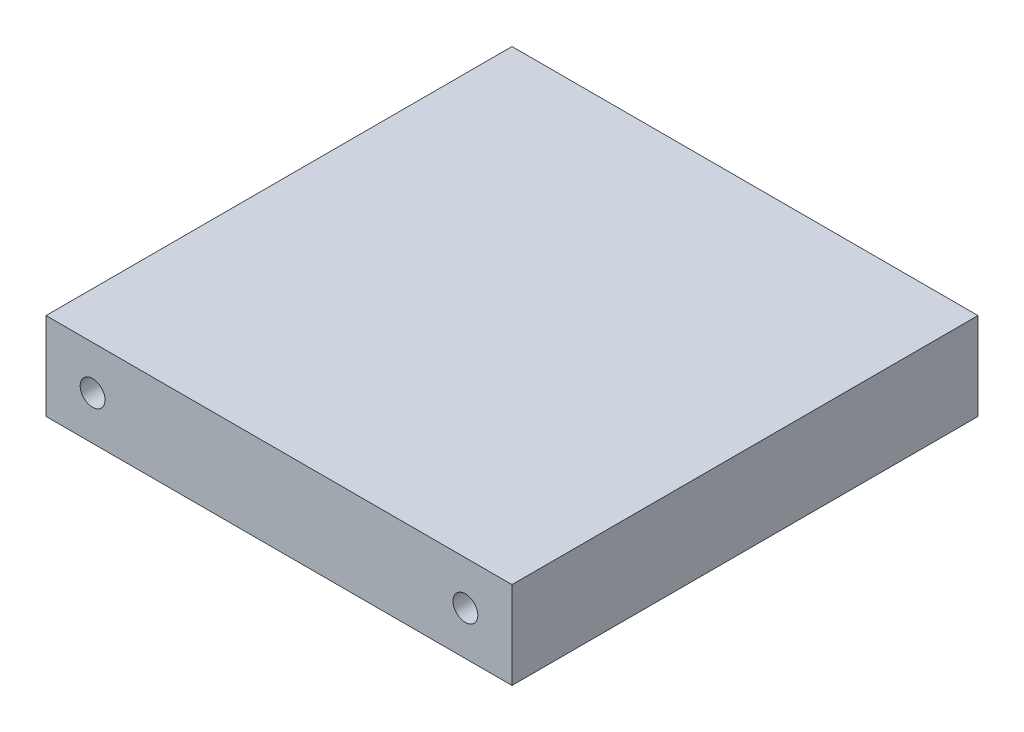
ISO-10303-21;
HEADER;
FILE_DESCRIPTION(('STEP AP214'),'2;1');
FILE_NAME('part.step','',(''),(''),'','','');
FILE_SCHEMA(('AUTOMOTIVE_DESIGN { 1 0 10303 214 1 1 1 1 }'));
ENDSEC;
DATA;
#1=APPLICATION_CONTEXT('core data for automotive mechanical design processes');
#2=APPLICATION_PROTOCOL_DEFINITION('international standard','automotive_design',2000,#1);
#3=PRODUCT_CONTEXT('',#1,'mechanical');
#4=PRODUCT('Part','Part','',(#3));
#5=PRODUCT_RELATED_PRODUCT_CATEGORY('part','',(#4));
#6=PRODUCT_DEFINITION_FORMATION('','',#4);
#7=PRODUCT_DEFINITION_CONTEXT('part definition',#1,'design');
#8=PRODUCT_DEFINITION('design','',#6,#7);
#9=PRODUCT_DEFINITION_SHAPE('','',#8);
#10=(LENGTH_UNIT() NAMED_UNIT(*) SI_UNIT(.MILLI.,.METRE.));
#11=(NAMED_UNIT(*) PLANE_ANGLE_UNIT() SI_UNIT($,.RADIAN.));
#12=(NAMED_UNIT(*) SI_UNIT($,.STERADIAN.) SOLID_ANGLE_UNIT());
#13=UNCERTAINTY_MEASURE_WITH_UNIT(LENGTH_MEASURE(1.E-05),#10,'distance_accuracy_value','');
#14=(GEOMETRIC_REPRESENTATION_CONTEXT(3) GLOBAL_UNCERTAINTY_ASSIGNED_CONTEXT((#13)) GLOBAL_UNIT_ASSIGNED_CONTEXT((#10,
#11,#12)) REPRESENTATION_CONTEXT('',''));
#15=CARTESIAN_POINT('',(0.,0.,0.));
#16=DIRECTION('',(0.,0.,1.));
#17=DIRECTION('',(1.,0.,0.));
#18=AXIS2_PLACEMENT_3D('',#15,#16,#17);
#19=CARTESIAN_POINT('',(-25.4,9.525,-25.4));
#20=DIRECTION('',(0.,0.,-1.));
#21=DIRECTION('',(-1.,0.,0.));
#22=AXIS2_PLACEMENT_3D('',#19,#20,#21);
#23=PLANE('',#22);
#24=CARTESIAN_POINT('',(20.32,4.7625,-25.4));
#25=DIRECTION('',(0.,0.,-1.));
#26=DIRECTION('',(-1.,0.,0.));
#27=AXIS2_PLACEMENT_3D('',#24,#25,#26);
#28=CIRCLE('',#27,1.35254999999999);
#29=CARTESIAN_POINT('',(18.96745,4.7625,-25.4));
#30=VERTEX_POINT('',#29);
#31=EDGE_CURVE('E110',#30,#30,#28,.T.);
#32=ORIENTED_EDGE('',*,*,#31,.F.);
#33=EDGE_LOOP('',(#32));
#34=FACE_BOUND('',#33,.T.);
#35=CARTESIAN_POINT('',(-20.32,4.7625,-25.4));
#36=DIRECTION('',(0.,0.,-1.));
#37=DIRECTION('',(-1.,0.,0.));
#38=AXIS2_PLACEMENT_3D('',#35,#36,#37);
#39=CIRCLE('',#38,1.35254999999999);
#40=CARTESIAN_POINT('',(-21.67255,4.7625,-25.4));
#41=VERTEX_POINT('',#40);
#42=EDGE_CURVE('E109',#41,#41,#39,.T.);
#43=ORIENTED_EDGE('',*,*,#42,.F.);
#44=EDGE_LOOP('',(#43));
#45=FACE_BOUND('',#44,.T.);
#46=DIRECTION('',(1.,0.,0.));
#47=VECTOR('',#46,1.);
#48=CARTESIAN_POINT('',(-25.4,0.,-25.4));
#49=LINE('',#48,#47);
#50=CARTESIAN_POINT('',(-25.4,0.,-25.4));
#51=VERTEX_POINT('',#50);
#52=CARTESIAN_POINT('',(25.4,0.,-25.4));
#53=VERTEX_POINT('',#52);
#54=EDGE_CURVE('E132',#51,#53,#49,.T.);
#55=ORIENTED_EDGE('',*,*,#54,.F.);
#56=DIRECTION('',(0.,-1.,0.));
#57=VECTOR('',#56,1.);
#58=CARTESIAN_POINT('',(-25.4,9.525,-25.4));
#59=LINE('',#58,#57);
#60=CARTESIAN_POINT('',(-25.4,9.525,-25.4));
#61=VERTEX_POINT('',#60);
#62=EDGE_CURVE('E11',#61,#51,#59,.T.);
#63=ORIENTED_EDGE('',*,*,#62,.F.);
#64=DIRECTION('',(1.,0.,0.));
#65=VECTOR('',#64,1.);
#66=CARTESIAN_POINT('',(-25.4,9.525,-25.4));
#67=LINE('',#66,#65);
#68=CARTESIAN_POINT('',(25.4,9.525,-25.4));
#69=VERTEX_POINT('',#68);
#70=EDGE_CURVE('E133',#61,#69,#67,.T.);
#71=ORIENTED_EDGE('',*,*,#70,.T.);
#72=DIRECTION('',(0.,-1.,0.));
#73=VECTOR('',#72,1.);
#74=CARTESIAN_POINT('',(25.4,9.525,-25.4));
#75=LINE('',#74,#73);
#76=EDGE_CURVE('E46',#69,#53,#75,.T.);
#77=ORIENTED_EDGE('',*,*,#76,.T.);
#78=EDGE_LOOP('',(#55,#63,#71,#77));
#79=FACE_BOUND('',#78,.T.);
#80=ADVANCED_FACE('F43',(#34,#45,#79),#23,.T.);
#81=CARTESIAN_POINT('',(-25.4,9.525,-25.4));
#82=DIRECTION('',(1.,0.,0.));
#83=DIRECTION('',(0.,0.,-1.));
#84=AXIS2_PLACEMENT_3D('',#81,#82,#83);
#85=PLANE('',#84);
#86=DIRECTION('',(0.,0.,1.));
#87=VECTOR('',#86,1.);
#88=CARTESIAN_POINT('',(-25.4,0.,-25.4));
#89=LINE('',#88,#87);
#90=CARTESIAN_POINT('',(-25.4,0.,25.4));
#91=VERTEX_POINT('',#90);
#92=EDGE_CURVE('E77',#51,#91,#89,.T.);
#93=ORIENTED_EDGE('',*,*,#92,.T.);
#94=DIRECTION('',(0.,-1.,0.));
#95=VECTOR('',#94,1.);
#96=CARTESIAN_POINT('',(-25.4,9.525,25.4));
#97=LINE('',#96,#95);
#98=CARTESIAN_POINT('',(-25.4,9.525,25.4));
#99=VERTEX_POINT('',#98);
#100=EDGE_CURVE('E52',#99,#91,#97,.T.);
#101=ORIENTED_EDGE('',*,*,#100,.F.);
#102=DIRECTION('',(0.,0.,1.));
#103=VECTOR('',#102,1.);
#104=CARTESIAN_POINT('',(-25.4,9.525,-25.4));
#105=LINE('',#104,#103);
#106=EDGE_CURVE('E139',#61,#99,#105,.T.);
#107=ORIENTED_EDGE('',*,*,#106,.F.);
#108=ORIENTED_EDGE('',*,*,#62,.T.);
#109=EDGE_LOOP('',(#93,#101,#107,#108));
#110=FACE_BOUND('',#109,.T.);
#111=ADVANCED_FACE('F160',(#110),#85,.F.);
#112=CARTESIAN_POINT('',(-25.4,9.525,25.4));
#113=DIRECTION('',(0.,0.,-1.));
#114=DIRECTION('',(-1.,0.,0.));
#115=AXIS2_PLACEMENT_3D('',#112,#113,#114);
#116=PLANE('',#115);
#117=CARTESIAN_POINT('',(-20.32,4.7625,25.4));
#118=DIRECTION('',(0.,0.,1.));
#119=DIRECTION('',(1.,0.,0.));
#120=AXIS2_PLACEMENT_3D('',#117,#118,#119);
#121=CIRCLE('',#120,1.35254999999999);
#122=CARTESIAN_POINT('',(-18.96745,4.7625,25.4));
#123=VERTEX_POINT('',#122);
#124=EDGE_CURVE('E120',#123,#123,#121,.T.);
#125=ORIENTED_EDGE('',*,*,#124,.F.);
#126=EDGE_LOOP('',(#125));
#127=FACE_BOUND('',#126,.T.);
#128=CARTESIAN_POINT('',(20.32,4.7625,25.4));
#129=DIRECTION('',(0.,0.,1.));
#130=DIRECTION('',(1.,0.,0.));
#131=AXIS2_PLACEMENT_3D('',#128,#129,#130);
#132=CIRCLE('',#131,1.35254999999999);
#133=CARTESIAN_POINT('',(21.67255,4.7625,25.4));
#134=VERTEX_POINT('',#133);
#135=EDGE_CURVE('E126',#134,#134,#132,.T.);
#136=ORIENTED_EDGE('',*,*,#135,.F.);
#137=EDGE_LOOP('',(#136));
#138=FACE_BOUND('',#137,.T.);
#139=DIRECTION('',(1.,0.,0.));
#140=VECTOR('',#139,1.);
#141=CARTESIAN_POINT('',(-25.4,0.,25.4));
#142=LINE('',#141,#140);
#143=CARTESIAN_POINT('',(25.4,0.,25.4));
#144=VERTEX_POINT('',#143);
#145=EDGE_CURVE('E146',#91,#144,#142,.T.);
#146=ORIENTED_EDGE('',*,*,#145,.T.);
#147=DIRECTION('',(0.,-1.,0.));
#148=VECTOR('',#147,1.);
#149=CARTESIAN_POINT('',(25.4,9.525,25.4));
#150=LINE('',#149,#148);
#151=CARTESIAN_POINT('',(25.4,9.525,25.4));
#152=VERTEX_POINT('',#151);
#153=EDGE_CURVE('E150',#152,#144,#150,.T.);
#154=ORIENTED_EDGE('',*,*,#153,.F.);
#155=DIRECTION('',(1.,0.,0.));
#156=VECTOR('',#155,1.);
#157=CARTESIAN_POINT('',(-25.4,9.525,25.4));
#158=LINE('',#157,#156);
#159=EDGE_CURVE('E137',#99,#152,#158,.T.);
#160=ORIENTED_EDGE('',*,*,#159,.F.);
#161=ORIENTED_EDGE('',*,*,#100,.T.);
#162=EDGE_LOOP('',(#146,#154,#160,#161));
#163=FACE_BOUND('',#162,.T.);
#164=ADVANCED_FACE('F158',(#127,#138,#163),#116,.F.);
#165=CARTESIAN_POINT('',(25.4,9.525,-25.4));
#166=DIRECTION('',(1.,0.,0.));
#167=DIRECTION('',(0.,0.,-1.));
#168=AXIS2_PLACEMENT_3D('',#165,#166,#167);
#169=PLANE('',#168);
#170=DIRECTION('',(0.,0.,1.));
#171=VECTOR('',#170,1.);
#172=CARTESIAN_POINT('',(25.4,0.,-25.4));
#173=LINE('',#172,#171);
#174=EDGE_CURVE('E143',#53,#144,#173,.T.);
#175=ORIENTED_EDGE('',*,*,#174,.F.);
#176=ORIENTED_EDGE('',*,*,#76,.F.);
#177=DIRECTION('',(0.,0.,1.));
#178=VECTOR('',#177,1.);
#179=CARTESIAN_POINT('',(25.4,9.525,-25.4));
#180=LINE('',#179,#178);
#181=EDGE_CURVE('E135',#69,#152,#180,.T.);
#182=ORIENTED_EDGE('',*,*,#181,.T.);
#183=ORIENTED_EDGE('',*,*,#153,.T.);
#184=EDGE_LOOP('',(#175,#176,#182,#183));
#185=FACE_BOUND('',#184,.T.);
#186=ADVANCED_FACE('F153',(#185),#169,.T.);
#187=CARTESIAN_POINT('',(0.,9.525,0.));
#188=DIRECTION('',(0.,-1.,0.));
#189=DIRECTION('',(0.,0.,-1.));
#190=AXIS2_PLACEMENT_3D('',#187,#188,#189);
#191=PLANE('',#190);
#192=ORIENTED_EDGE('',*,*,#70,.F.);
#193=ORIENTED_EDGE('',*,*,#106,.T.);
#194=ORIENTED_EDGE('',*,*,#159,.T.);
#195=ORIENTED_EDGE('',*,*,#181,.F.);
#196=EDGE_LOOP('',(#192,#193,#194,#195));
#197=FACE_BOUND('',#196,.T.);
#198=ADVANCED_FACE('F162',(#197),#191,.F.);
#199=CARTESIAN_POINT('',(0.,0.,0.));
#200=DIRECTION('',(0.,-1.,0.));
#201=DIRECTION('',(0.,0.,-1.));
#202=AXIS2_PLACEMENT_3D('',#199,#200,#201);
#203=PLANE('',#202);
#204=ORIENTED_EDGE('',*,*,#54,.T.);
#205=ORIENTED_EDGE('',*,*,#174,.T.);
#206=ORIENTED_EDGE('',*,*,#145,.F.);
#207=ORIENTED_EDGE('',*,*,#92,.F.);
#208=EDGE_LOOP('',(#204,#205,#206,#207));
#209=FACE_BOUND('',#208,.T.);
#210=ADVANCED_FACE('F156',(#209),#203,.T.);
#211=CARTESIAN_POINT('',(20.32,4.7625,16.002));
#212=DIRECTION('',(0.,0.,1.));
#213=DIRECTION('',(1.,0.,0.));
#214=AXIS2_PLACEMENT_3D('',#211,#212,#213);
#215=CONICAL_SURFACE('',#214,1.35255,1.02974425867665);
#216=CARTESIAN_POINT('',(20.32,4.7625,15.1893059697343));
#217=VERTEX_POINT('',#216);
#218=VERTEX_LOOP('',#217);
#219=FACE_BOUND('',#218,.T.);
#220=CARTESIAN_POINT('',(20.32,4.7625,16.002));
#221=DIRECTION('',(0.,0.,1.));
#222=DIRECTION('',(1.,0.,0.));
#223=AXIS2_PLACEMENT_3D('',#220,#221,#222);
#224=CIRCLE('',#223,1.35255);
#225=CARTESIAN_POINT('',(21.67255,4.7625,16.002));
#226=VERTEX_POINT('',#225);
#227=EDGE_CURVE('E129',#226,#226,#224,.T.);
#228=ORIENTED_EDGE('',*,*,#227,.T.);
#229=EDGE_LOOP('',(#228));
#230=FACE_BOUND('',#229,.T.);
#231=ADVANCED_FACE('F169',(#219,#230),#215,.F.);
#232=CARTESIAN_POINT('',(20.32,4.7625,25.4));
#233=DIRECTION('',(0.,0.,1.));
#234=DIRECTION('',(1.,0.,0.));
#235=AXIS2_PLACEMENT_3D('',#232,#233,#234);
#236=CYLINDRICAL_SURFACE('',#235,1.35254999999999);
#237=ORIENTED_EDGE('',*,*,#227,.F.);
#238=EDGE_LOOP('',(#237));
#239=FACE_BOUND('',#238,.T.);
#240=ORIENTED_EDGE('',*,*,#135,.T.);
#241=EDGE_LOOP('',(#240));
#242=FACE_BOUND('',#241,.T.);
#243=ADVANCED_FACE('F201',(#239,#242),#236,.F.);
#244=CARTESIAN_POINT('',(-20.32,4.7625,16.002));
#245=DIRECTION('',(0.,0.,1.));
#246=DIRECTION('',(1.,0.,0.));
#247=AXIS2_PLACEMENT_3D('',#244,#245,#246);
#248=CONICAL_SURFACE('',#247,1.35255,1.02974425867665);
#249=CARTESIAN_POINT('',(-20.32,4.7625,15.1893059697343));
#250=VERTEX_POINT('',#249);
#251=VERTEX_LOOP('',#250);
#252=FACE_BOUND('',#251,.T.);
#253=CARTESIAN_POINT('',(-20.32,4.7625,16.002));
#254=DIRECTION('',(0.,0.,1.));
#255=DIRECTION('',(1.,0.,0.));
#256=AXIS2_PLACEMENT_3D('',#253,#254,#255);
#257=CIRCLE('',#256,1.35255);
#258=CARTESIAN_POINT('',(-18.96745,4.7625,16.002));
#259=VERTEX_POINT('',#258);
#260=EDGE_CURVE('E123',#259,#259,#257,.T.);
#261=ORIENTED_EDGE('',*,*,#260,.T.);
#262=EDGE_LOOP('',(#261));
#263=FACE_BOUND('',#262,.T.);
#264=ADVANCED_FACE('F197',(#252,#263),#248,.F.);
#265=CARTESIAN_POINT('',(-20.32,4.7625,25.4));
#266=DIRECTION('',(0.,0.,1.));
#267=DIRECTION('',(1.,0.,0.));
#268=AXIS2_PLACEMENT_3D('',#265,#266,#267);
#269=CYLINDRICAL_SURFACE('',#268,1.35254999999999);
#270=ORIENTED_EDGE('',*,*,#260,.F.);
#271=EDGE_LOOP('',(#270));
#272=FACE_BOUND('',#271,.T.);
#273=ORIENTED_EDGE('',*,*,#124,.T.);
#274=EDGE_LOOP('',(#273));
#275=FACE_BOUND('',#274,.T.);
#276=ADVANCED_FACE('F189',(#272,#275),#269,.F.);
#277=CARTESIAN_POINT('',(-20.32,4.7625,-16.002));
#278=DIRECTION('',(0.,0.,-1.));
#279=DIRECTION('',(-1.,0.,0.));
#280=AXIS2_PLACEMENT_3D('',#277,#278,#279);
#281=CONICAL_SURFACE('',#280,1.35254999999999,1.02974425867665);
#282=CARTESIAN_POINT('',(-20.32,4.7625,-15.1893059697343));
#283=VERTEX_POINT('',#282);
#284=VERTEX_LOOP('',#283);
#285=FACE_BOUND('',#284,.T.);
#286=CARTESIAN_POINT('',(-20.32,4.7625,-16.002));
#287=DIRECTION('',(0.,0.,-1.));
#288=DIRECTION('',(-1.,0.,0.));
#289=AXIS2_PLACEMENT_3D('',#286,#287,#288);
#290=CIRCLE('',#289,1.35254999999999);
#291=CARTESIAN_POINT('',(-21.67255,4.7625,-16.002));
#292=VERTEX_POINT('',#291);
#293=EDGE_CURVE('E113',#292,#292,#290,.T.);
#294=ORIENTED_EDGE('',*,*,#293,.T.);
#295=EDGE_LOOP('',(#294));
#296=FACE_BOUND('',#295,.T.);
#297=ADVANCED_FACE('F183',(#285,#296),#281,.F.);
#298=CARTESIAN_POINT('',(-20.32,4.7625,-25.4));
#299=DIRECTION('',(0.,0.,-1.));
#300=DIRECTION('',(-1.,0.,0.));
#301=AXIS2_PLACEMENT_3D('',#298,#299,#300);
#302=CYLINDRICAL_SURFACE('',#301,1.35254999999999);
#303=ORIENTED_EDGE('',*,*,#293,.F.);
#304=EDGE_LOOP('',(#303));
#305=FACE_BOUND('',#304,.T.);
#306=ORIENTED_EDGE('',*,*,#42,.T.);
#307=EDGE_LOOP('',(#306));
#308=FACE_BOUND('',#307,.T.);
#309=ADVANCED_FACE('F103',(#305,#308),#302,.F.);
#310=CARTESIAN_POINT('',(20.32,4.7625,-16.002));
#311=DIRECTION('',(0.,0.,-1.));
#312=DIRECTION('',(-1.,0.,0.));
#313=AXIS2_PLACEMENT_3D('',#310,#311,#312);
#314=CONICAL_SURFACE('',#313,1.35254999999999,1.02974425867665);
#315=CARTESIAN_POINT('',(20.32,4.7625,-15.1893059697343));
#316=VERTEX_POINT('',#315);
#317=VERTEX_LOOP('',#316);
#318=FACE_BOUND('',#317,.T.);
#319=CARTESIAN_POINT('',(20.32,4.7625,-16.002));
#320=DIRECTION('',(0.,0.,-1.));
#321=DIRECTION('',(-1.,0.,0.));
#322=AXIS2_PLACEMENT_3D('',#319,#320,#321);
#323=CIRCLE('',#322,1.35254999999999);
#324=CARTESIAN_POINT('',(18.96745,4.7625,-16.002));
#325=VERTEX_POINT('',#324);
#326=EDGE_CURVE('E107',#325,#325,#323,.T.);
#327=ORIENTED_EDGE('',*,*,#326,.T.);
#328=EDGE_LOOP('',(#327));
#329=FACE_BOUND('',#328,.T.);
#330=ADVANCED_FACE('F99',(#318,#329),#314,.F.);
#331=CARTESIAN_POINT('',(20.32,4.7625,-25.4));
#332=DIRECTION('',(0.,0.,-1.));
#333=DIRECTION('',(-1.,0.,0.));
#334=AXIS2_PLACEMENT_3D('',#331,#332,#333);
#335=CYLINDRICAL_SURFACE('',#334,1.35254999999999);
#336=ORIENTED_EDGE('',*,*,#326,.F.);
#337=EDGE_LOOP('',(#336));
#338=FACE_BOUND('',#337,.T.);
#339=ORIENTED_EDGE('',*,*,#31,.T.);
#340=EDGE_LOOP('',(#339));
#341=FACE_BOUND('',#340,.T.);
#342=ADVANCED_FACE('F102',(#338,#341),#335,.F.);
#343=CLOSED_SHELL('',(#80,#111,#164,#186,#198,#210,#231,#243,#264,#276,#297,#309,#330,#342));
#344=MANIFOLD_SOLID_BREP('B2',#343);
#345=ADVANCED_BREP_SHAPE_REPRESENTATION('',(#18,#344),#14);
#346=SHAPE_DEFINITION_REPRESENTATION(#9,#345);
ENDSEC;
END-ISO-10303-21;
